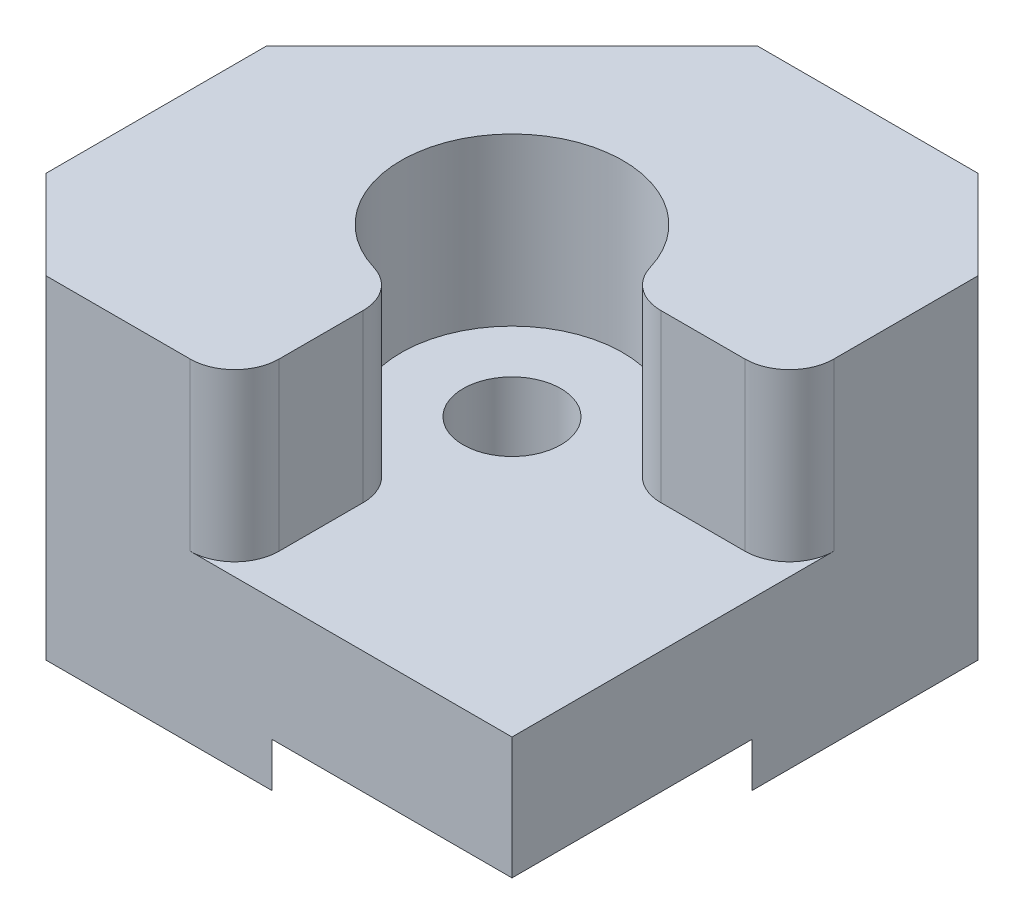
ISO-10303-21;
HEADER;
FILE_DESCRIPTION(('STEP AP214'),'2;1');
FILE_NAME('part.step','',(''),(''),'','','');
FILE_SCHEMA(('AUTOMOTIVE_DESIGN { 1 0 10303 214 1 1 1 1 }'));
ENDSEC;
DATA;
#1=APPLICATION_CONTEXT('core data for automotive mechanical design processes');
#2=APPLICATION_PROTOCOL_DEFINITION('international standard','automotive_design',2000,#1);
#3=PRODUCT_CONTEXT('',#1,'mechanical');
#4=PRODUCT('Part','Part','',(#3));
#5=PRODUCT_RELATED_PRODUCT_CATEGORY('part','',(#4));
#6=PRODUCT_DEFINITION_FORMATION('','',#4);
#7=PRODUCT_DEFINITION_CONTEXT('part definition',#1,'design');
#8=PRODUCT_DEFINITION('design','',#6,#7);
#9=PRODUCT_DEFINITION_SHAPE('','',#8);
#10=(LENGTH_UNIT() NAMED_UNIT(*) SI_UNIT(.MILLI.,.METRE.));
#11=(NAMED_UNIT(*) PLANE_ANGLE_UNIT() SI_UNIT($,.RADIAN.));
#12=(NAMED_UNIT(*) SI_UNIT($,.STERADIAN.) SOLID_ANGLE_UNIT());
#13=UNCERTAINTY_MEASURE_WITH_UNIT(LENGTH_MEASURE(1.E-05),#10,'distance_accuracy_value','');
#14=(GEOMETRIC_REPRESENTATION_CONTEXT(3) GLOBAL_UNCERTAINTY_ASSIGNED_CONTEXT((#13)) GLOBAL_UNIT_ASSIGNED_CONTEXT((#10,
#11,#12)) REPRESENTATION_CONTEXT('',''));
#15=CARTESIAN_POINT('',(0.,0.,0.));
#16=DIRECTION('',(0.,0.,1.));
#17=DIRECTION('',(1.,0.,0.));
#18=AXIS2_PLACEMENT_3D('',#15,#16,#17);
#19=CARTESIAN_POINT('',(0.,-7.5,0.));
#20=DIRECTION('',(0.,1.,0.));
#21=DIRECTION('',(0.,0.,1.));
#22=AXIS2_PLACEMENT_3D('',#19,#20,#21);
#23=PLANE('',#22);
#24=DIRECTION('',(1.,0.,0.));
#25=VECTOR('',#24,1.);
#26=CARTESIAN_POINT('',(-12.5,-7.5,12.5));
#27=LINE('',#26,#25);
#28=CARTESIAN_POINT('',(-8.49999999999999,-7.5,12.5));
#29=VERTEX_POINT('',#28);
#30=CARTESIAN_POINT('',(1.68126624784581,-7.5,12.5));
#31=VERTEX_POINT('',#30);
#32=EDGE_CURVE('E242',#29,#31,#27,.T.);
#33=ORIENTED_EDGE('',*,*,#32,.F.);
#34=DIRECTION('',(0.707106781186546,0.,0.707106781186549));
#35=VECTOR('',#34,1.);
#36=CARTESIAN_POINT('',(-8.49999999999999,-7.5,12.5));
#37=LINE('',#36,#35);
#38=CARTESIAN_POINT('',(-12.5,-7.5,8.49999999999997));
#39=VERTEX_POINT('',#38);
#40=EDGE_CURVE('E285',#29,#39,#37,.F.);
#41=ORIENTED_EDGE('',*,*,#40,.T.);
#42=DIRECTION('',(0.,0.,1.));
#43=VECTOR('',#42,1.);
#44=CARTESIAN_POINT('',(-12.5,-7.5,-12.5));
#45=LINE('',#44,#43);
#46=CARTESIAN_POINT('',(-12.5,-7.5,-1.68126624784581));
#47=VERTEX_POINT('',#46);
#48=EDGE_CURVE('E254',#47,#39,#45,.T.);
#49=ORIENTED_EDGE('',*,*,#48,.F.);
#50=DIRECTION('',(-0.707106781186548,0.,-0.707106781186547));
#51=VECTOR('',#50,1.);
#52=CARTESIAN_POINT('',(-12.5,-7.5,-1.68126624784581));
#53=LINE('',#52,#51);
#54=EDGE_CURVE('E397',#31,#47,#53,.T.);
#55=ORIENTED_EDGE('',*,*,#54,.F.);
#56=EDGE_LOOP('',(#33,#41,#49,#55));
#57=FACE_BOUND('',#56,.T.);
#58=ADVANCED_FACE('F39',(#57),#23,.F.);
#59=CARTESIAN_POINT('',(12.5,7.5,-12.5));
#60=DIRECTION('',(-1.,0.,0.));
#61=DIRECTION('',(0.,0.,1.));
#62=AXIS2_PLACEMENT_3D('',#59,#60,#61);
#63=PLANE('',#62);
#64=DIRECTION('',(0.,0.,-1.));
#65=VECTOR('',#64,1.);
#66=CARTESIAN_POINT('',(12.5,7.5,-12.5));
#67=LINE('',#66,#65);
#68=CARTESIAN_POINT('',(12.5,7.5,-2.));
#69=VERTEX_POINT('',#68);
#70=CARTESIAN_POINT('',(12.5,7.5,-8.50000000000001));
#71=VERTEX_POINT('',#70);
#72=EDGE_CURVE('E239',#69,#71,#67,.T.);
#73=ORIENTED_EDGE('',*,*,#72,.F.);
#74=DIRECTION('',(0.,1.,0.));
#75=VECTOR('',#74,1.);
#76=CARTESIAN_POINT('',(12.5,7.5,-2.));
#77=LINE('',#76,#75);
#78=CARTESIAN_POINT('',(12.5,0.,-2.));
#79=VERTEX_POINT('',#78);
#80=EDGE_CURVE('E309',#69,#79,#77,.F.);
#81=ORIENTED_EDGE('',*,*,#80,.T.);
#82=DIRECTION('',(0.,0.,1.));
#83=VECTOR('',#82,1.);
#84=CARTESIAN_POINT('',(12.5,0.,12.5));
#85=LINE('',#84,#83);
#86=CARTESIAN_POINT('',(12.5,0.,12.5));
#87=VERTEX_POINT('',#86);
#88=EDGE_CURVE('E226',#79,#87,#85,.T.);
#89=ORIENTED_EDGE('',*,*,#88,.T.);
#90=DIRECTION('',(0.,-1.,0.));
#91=VECTOR('',#90,1.);
#92=CARTESIAN_POINT('',(12.5,7.5,12.5));
#93=LINE('',#92,#91);
#94=CARTESIAN_POINT('',(12.5,-5.5,12.5));
#95=VERTEX_POINT('',#94);
#96=EDGE_CURVE('E250',#87,#95,#93,.T.);
#97=ORIENTED_EDGE('',*,*,#96,.T.);
#98=DIRECTION('',(0.,0.,1.));
#99=VECTOR('',#98,1.);
#100=CARTESIAN_POINT('',(12.5,-5.5,12.5));
#101=LINE('',#100,#99);
#102=CARTESIAN_POINT('',(12.5,-5.5,1.68126624784584));
#103=VERTEX_POINT('',#102);
#104=EDGE_CURVE('E198',#103,#95,#101,.T.);
#105=ORIENTED_EDGE('',*,*,#104,.F.);
#106=DIRECTION('',(0.,-1.,0.));
#107=VECTOR('',#106,1.);
#108=CARTESIAN_POINT('',(12.5,-5.5,1.68126624784584));
#109=LINE('',#108,#107);
#110=CARTESIAN_POINT('',(12.5,-7.5,1.68126624784584));
#111=VERTEX_POINT('',#110);
#112=EDGE_CURVE('E197',#103,#111,#109,.T.);
#113=ORIENTED_EDGE('',*,*,#112,.T.);
#114=DIRECTION('',(0.,0.,-1.));
#115=VECTOR('',#114,1.);
#116=CARTESIAN_POINT('',(12.5,-7.5,-12.5));
#117=LINE('',#116,#115);
#118=CARTESIAN_POINT('',(12.5,-7.5,-8.50000000000001));
#119=VERTEX_POINT('',#118);
#120=EDGE_CURVE('E238',#111,#119,#117,.T.);
#121=ORIENTED_EDGE('',*,*,#120,.T.);
#122=DIRECTION('',(0.,1.,0.));
#123=VECTOR('',#122,1.);
#124=CARTESIAN_POINT('',(12.5,7.5,-8.50000000000001));
#125=LINE('',#124,#123);
#126=EDGE_CURVE('E269',#119,#71,#125,.T.);
#127=ORIENTED_EDGE('',*,*,#126,.T.);
#128=EDGE_LOOP('',(#73,#81,#89,#97,#105,#113,#121,#127));
#129=FACE_BOUND('',#128,.T.);
#130=ADVANCED_FACE('F356',(#129),#63,.F.);
#131=CARTESIAN_POINT('',(-12.5,7.5,-12.5));
#132=DIRECTION('',(0.,0.,1.));
#133=DIRECTION('',(1.,0.,0.));
#134=AXIS2_PLACEMENT_3D('',#131,#132,#133);
#135=PLANE('',#134);
#136=DIRECTION('',(0.,1.,0.));
#137=VECTOR('',#136,1.);
#138=CARTESIAN_POINT('',(-8.49999999999999,7.5,-12.5));
#139=LINE('',#138,#137);
#140=CARTESIAN_POINT('',(-8.49999999999999,-5.5,-12.5));
#141=VERTEX_POINT('',#140);
#142=CARTESIAN_POINT('',(-8.49999999999999,2.49999999999998,-12.5));
#143=VERTEX_POINT('',#142);
#144=EDGE_CURVE('E260',#141,#143,#139,.T.);
#145=ORIENTED_EDGE('',*,*,#144,.T.);
#146=DIRECTION('',(0.816496580927726,0.577350269189627,0.));
#147=VECTOR('',#146,1.);
#148=CARTESIAN_POINT('',(-5.119288125423,4.89052429175126,-12.5));
#149=LINE('',#148,#147);
#150=CARTESIAN_POINT('',(-1.4289321881345,7.5,-12.5));
#151=VERTEX_POINT('',#150);
#152=EDGE_CURVE('E294',#143,#151,#149,.T.);
#153=ORIENTED_EDGE('',*,*,#152,.T.);
#154=DIRECTION('',(-1.,0.,0.));
#155=VECTOR('',#154,1.);
#156=CARTESIAN_POINT('',(-12.5,7.5,-12.5));
#157=LINE('',#156,#155);
#158=CARTESIAN_POINT('',(8.50000000000002,7.5,-12.5));
#159=VERTEX_POINT('',#158);
#160=EDGE_CURVE('E241',#159,#151,#157,.T.);
#161=ORIENTED_EDGE('',*,*,#160,.F.);
#162=DIRECTION('',(0.,-1.,0.));
#163=VECTOR('',#162,1.);
#164=CARTESIAN_POINT('',(8.50000000000002,7.5,-12.5));
#165=LINE('',#164,#163);
#166=CARTESIAN_POINT('',(8.50000000000002,-7.5,-12.5));
#167=VERTEX_POINT('',#166);
#168=EDGE_CURVE('E265',#159,#167,#165,.T.);
#169=ORIENTED_EDGE('',*,*,#168,.T.);
#170=DIRECTION('',(-1.,0.,0.));
#171=VECTOR('',#170,1.);
#172=CARTESIAN_POINT('',(-12.5,-7.5,-12.5));
#173=LINE('',#172,#171);
#174=CARTESIAN_POINT('',(-1.68126624784584,-7.5,-12.5));
#175=VERTEX_POINT('',#174);
#176=EDGE_CURVE('E203',#167,#175,#173,.T.);
#177=ORIENTED_EDGE('',*,*,#176,.T.);
#178=DIRECTION('',(0.,-1.,0.));
#179=VECTOR('',#178,1.);
#180=CARTESIAN_POINT('',(-1.68126624784584,-5.5,-12.5));
#181=LINE('',#180,#179);
#182=CARTESIAN_POINT('',(-1.68126624784584,-5.5,-12.5));
#183=VERTEX_POINT('',#182);
#184=EDGE_CURVE('E194',#183,#175,#181,.T.);
#185=ORIENTED_EDGE('',*,*,#184,.F.);
#186=DIRECTION('',(1.,0.,0.));
#187=VECTOR('',#186,1.);
#188=CARTESIAN_POINT('',(-1.68126624784584,-5.5,-12.5));
#189=LINE('',#188,#187);
#190=EDGE_CURVE('E176',#141,#183,#189,.T.);
#191=ORIENTED_EDGE('',*,*,#190,.F.);
#192=EDGE_LOOP('',(#145,#153,#161,#169,#177,#185,#191));
#193=FACE_BOUND('',#192,.T.);
#194=ADVANCED_FACE('F200',(#193),#135,.F.);
#195=CARTESIAN_POINT('',(-12.5,7.5,-12.5));
#196=DIRECTION('',(1.,0.,0.));
#197=DIRECTION('',(0.,0.,-1.));
#198=AXIS2_PLACEMENT_3D('',#195,#196,#197);
#199=PLANE('',#198);
#200=DIRECTION('',(0.,0.,1.));
#201=VECTOR('',#200,1.);
#202=CARTESIAN_POINT('',(-12.5,7.5,-12.5));
#203=LINE('',#202,#201);
#204=CARTESIAN_POINT('',(-12.5,7.5,-1.42893218813455));
#205=VERTEX_POINT('',#204);
#206=CARTESIAN_POINT('',(-12.5,7.5,8.49999999999997));
#207=VERTEX_POINT('',#206);
#208=EDGE_CURVE('E245',#205,#207,#203,.T.);
#209=ORIENTED_EDGE('',*,*,#208,.F.);
#210=DIRECTION('',(0.,-0.577350269189628,-0.816496580927725));
#211=VECTOR('',#210,1.);
#212=CARTESIAN_POINT('',(-12.5,4.89052429175127,-5.11928812542302));
#213=LINE('',#212,#211);
#214=CARTESIAN_POINT('',(-12.5,2.49999999999998,-8.50000000000002));
#215=VERTEX_POINT('',#214);
#216=EDGE_CURVE('E290',#205,#215,#213,.T.);
#217=ORIENTED_EDGE('',*,*,#216,.T.);
#218=DIRECTION('',(0.,-1.,0.));
#219=VECTOR('',#218,1.);
#220=CARTESIAN_POINT('',(-12.5,7.5,-8.50000000000002));
#221=LINE('',#220,#219);
#222=CARTESIAN_POINT('',(-12.5,-5.5,-8.50000000000002));
#223=VERTEX_POINT('',#222);
#224=EDGE_CURVE('E279',#215,#223,#221,.T.);
#225=ORIENTED_EDGE('',*,*,#224,.T.);
#226=DIRECTION('',(0.,0.,-1.));
#227=VECTOR('',#226,1.);
#228=CARTESIAN_POINT('',(-12.5,-5.5,-12.5));
#229=LINE('',#228,#227);
#230=CARTESIAN_POINT('',(-12.5,-5.5,-1.68126624784581));
#231=VERTEX_POINT('',#230);
#232=EDGE_CURVE('E189',#231,#223,#229,.T.);
#233=ORIENTED_EDGE('',*,*,#232,.F.);
#234=DIRECTION('',(0.,-1.,0.));
#235=VECTOR('',#234,1.);
#236=CARTESIAN_POINT('',(-12.5,-5.5,-1.68126624784581));
#237=LINE('',#236,#235);
#238=EDGE_CURVE('E263',#231,#47,#237,.T.);
#239=ORIENTED_EDGE('',*,*,#238,.T.);
#240=ORIENTED_EDGE('',*,*,#48,.T.);
#241=DIRECTION('',(0.,1.,0.));
#242=VECTOR('',#241,1.);
#243=CARTESIAN_POINT('',(-12.5,7.5,8.49999999999997));
#244=LINE('',#243,#242);
#245=EDGE_CURVE('E276',#39,#207,#244,.T.);
#246=ORIENTED_EDGE('',*,*,#245,.T.);
#247=EDGE_LOOP('',(#209,#217,#225,#233,#239,#240,#246));
#248=FACE_BOUND('',#247,.T.);
#249=ADVANCED_FACE('F371',(#248),#199,.F.);
#250=CARTESIAN_POINT('',(-12.5,7.5,12.5));
#251=DIRECTION('',(0.,0.,-1.));
#252=DIRECTION('',(-1.,0.,0.));
#253=AXIS2_PLACEMENT_3D('',#250,#251,#252);
#254=PLANE('',#253);
#255=DIRECTION('',(-1.,0.,0.));
#256=VECTOR('',#255,1.);
#257=CARTESIAN_POINT('',(0.,0.,12.5));
#258=LINE('',#257,#256);
#259=CARTESIAN_POINT('',(-2.,0.,12.5));
#260=VERTEX_POINT('',#259);
#261=EDGE_CURVE('E224',#87,#260,#258,.T.);
#262=ORIENTED_EDGE('',*,*,#261,.T.);
#263=DIRECTION('',(0.,1.,0.));
#264=VECTOR('',#263,1.);
#265=CARTESIAN_POINT('',(-2.,7.5,12.5));
#266=LINE('',#265,#264);
#267=CARTESIAN_POINT('',(-2.,7.5,12.5));
#268=VERTEX_POINT('',#267);
#269=EDGE_CURVE('E312',#260,#268,#266,.T.);
#270=ORIENTED_EDGE('',*,*,#269,.T.);
#271=DIRECTION('',(1.,0.,0.));
#272=VECTOR('',#271,1.);
#273=CARTESIAN_POINT('',(-12.5,7.5,12.5));
#274=LINE('',#273,#272);
#275=CARTESIAN_POINT('',(-8.49999999999999,7.5,12.5));
#276=VERTEX_POINT('',#275);
#277=EDGE_CURVE('E247',#276,#268,#274,.T.);
#278=ORIENTED_EDGE('',*,*,#277,.F.);
#279=DIRECTION('',(0.,-1.,0.));
#280=VECTOR('',#279,1.);
#281=CARTESIAN_POINT('',(-8.49999999999999,7.5,12.5));
#282=LINE('',#281,#280);
#283=EDGE_CURVE('E282',#276,#29,#282,.T.);
#284=ORIENTED_EDGE('',*,*,#283,.T.);
#285=ORIENTED_EDGE('',*,*,#32,.T.);
#286=DIRECTION('',(0.,-1.,0.));
#287=VECTOR('',#286,1.);
#288=CARTESIAN_POINT('',(1.68126624784581,-5.5,12.5));
#289=LINE('',#288,#287);
#290=CARTESIAN_POINT('',(1.68126624784581,-5.5,12.5));
#291=VERTEX_POINT('',#290);
#292=EDGE_CURVE('E206',#291,#31,#289,.T.);
#293=ORIENTED_EDGE('',*,*,#292,.F.);
#294=DIRECTION('',(-1.,0.,0.));
#295=VECTOR('',#294,1.);
#296=CARTESIAN_POINT('',(1.68126624784581,-5.5,12.5));
#297=LINE('',#296,#295);
#298=EDGE_CURVE('E209',#95,#291,#297,.T.);
#299=ORIENTED_EDGE('',*,*,#298,.F.);
#300=ORIENTED_EDGE('',*,*,#96,.F.);
#301=EDGE_LOOP('',(#262,#270,#278,#284,#285,#293,#299,#300));
#302=FACE_BOUND('',#301,.T.);
#303=ADVANCED_FACE('F382',(#302),#254,.F.);
#304=CARTESIAN_POINT('',(0.,7.5,0.));
#305=DIRECTION('',(0.,1.,0.));
#306=DIRECTION('',(0.,0.,1.));
#307=AXIS2_PLACEMENT_3D('',#304,#305,#306);
#308=PLANE('',#307);
#309=DIRECTION('',(-1.,0.,0.));
#310=VECTOR('',#309,1.);
#311=CARTESIAN_POINT('',(12.5,7.5,0.));
#312=LINE('',#311,#310);
#313=CARTESIAN_POINT('',(10.5,7.5,0.));
#314=VERTEX_POINT('',#313);
#315=CARTESIAN_POINT('',(6.70820393249937,7.5,0.));
#316=VERTEX_POINT('',#315);
#317=EDGE_CURVE('E216',#314,#316,#312,.T.);
#318=ORIENTED_EDGE('',*,*,#317,.F.);
#319=CARTESIAN_POINT('',(10.5,7.5,-2.));
#320=DIRECTION('',(0.,1.,0.));
#321=DIRECTION('',(0.,0.,1.));
#322=AXIS2_PLACEMENT_3D('',#319,#320,#321);
#323=CIRCLE('',#322,2.);
#324=EDGE_CURVE('E307',#314,#69,#323,.T.);
#325=ORIENTED_EDGE('',*,*,#324,.T.);
#326=ORIENTED_EDGE('',*,*,#72,.T.);
#327=DIRECTION('',(0.707106781186546,0.,0.707106781186549));
#328=VECTOR('',#327,1.);
#329=CARTESIAN_POINT('',(10.5,7.5,-10.5));
#330=LINE('',#329,#328);
#331=EDGE_CURVE('E274',#71,#159,#330,.F.);
#332=ORIENTED_EDGE('',*,*,#331,.T.);
#333=ORIENTED_EDGE('',*,*,#160,.T.);
#334=DIRECTION('',(-0.707106781186549,0.,0.707106781186546));
#335=VECTOR('',#334,1.);
#336=CARTESIAN_POINT('',(-6.96446609406726,7.5,-6.96446609406728));
#337=LINE('',#336,#335);
#338=EDGE_CURVE('E287',#151,#205,#337,.T.);
#339=ORIENTED_EDGE('',*,*,#338,.T.);
#340=ORIENTED_EDGE('',*,*,#208,.T.);
#341=DIRECTION('',(-0.707106781186546,0.,-0.707106781186549));
#342=VECTOR('',#341,1.);
#343=CARTESIAN_POINT('',(-10.5,7.5,10.5));
#344=LINE('',#343,#342);
#345=EDGE_CURVE('E272',#207,#276,#344,.F.);
#346=ORIENTED_EDGE('',*,*,#345,.T.);
#347=ORIENTED_EDGE('',*,*,#277,.T.);
#348=CARTESIAN_POINT('',(-2.,7.5,10.5));
#349=DIRECTION('',(0.,1.,0.));
#350=DIRECTION('',(0.,0.,1.));
#351=AXIS2_PLACEMENT_3D('',#348,#349,#350);
#352=CIRCLE('',#351,2.);
#353=CARTESIAN_POINT('',(0.,7.5,10.5));
#354=VERTEX_POINT('',#353);
#355=EDGE_CURVE('E305',#268,#354,#352,.T.);
#356=ORIENTED_EDGE('',*,*,#355,.T.);
#357=DIRECTION('',(0.,0.,1.));
#358=VECTOR('',#357,1.);
#359=CARTESIAN_POINT('',(0.,7.5,5.));
#360=LINE('',#359,#358);
#361=CARTESIAN_POINT('',(0.,7.5,6.70820393249937));
#362=VERTEX_POINT('',#361);
#363=EDGE_CURVE('E221',#362,#354,#360,.T.);
#364=ORIENTED_EDGE('',*,*,#363,.F.);
#365=CARTESIAN_POINT('',(-2.,7.5,6.70820393249937));
#366=DIRECTION('',(0.,1.,0.));
#367=DIRECTION('',(0.,0.,1.));
#368=AXIS2_PLACEMENT_3D('',#365,#366,#367);
#369=CIRCLE('',#368,2.);
#370=CARTESIAN_POINT('',(-1.42857142857143,7.5,4.79157423749955));
#371=VERTEX_POINT('',#370);
#372=EDGE_CURVE('E303',#362,#371,#369,.T.);
#373=ORIENTED_EDGE('',*,*,#372,.T.);
#374=CARTESIAN_POINT('',(0.,7.5,0.));
#375=DIRECTION('',(0.,1.,0.));
#376=DIRECTION('',(0.,0.,1.));
#377=AXIS2_PLACEMENT_3D('',#374,#375,#376);
#378=CIRCLE('',#377,5.);
#379=CARTESIAN_POINT('',(4.79157423749955,7.5,-1.42857142857143));
#380=VERTEX_POINT('',#379);
#381=EDGE_CURVE('E232',#380,#371,#378,.T.);
#382=ORIENTED_EDGE('',*,*,#381,.F.);
#383=CARTESIAN_POINT('',(6.70820393249937,7.5,-2.));
#384=DIRECTION('',(0.,1.,0.));
#385=DIRECTION('',(0.,0.,1.));
#386=AXIS2_PLACEMENT_3D('',#383,#384,#385);
#387=CIRCLE('',#386,2.);
#388=EDGE_CURVE('E301',#380,#316,#387,.T.);
#389=ORIENTED_EDGE('',*,*,#388,.T.);
#390=EDGE_LOOP('',(#318,#325,#326,#332,#333,#339,#340,#346,#347,#356,#364,#373,#382,#389));
#391=FACE_BOUND('',#390,.T.);
#392=ADVANCED_FACE('F342',(#391),#308,.T.);
#393=ORIENTED_EDGE('',*,*,#176,.F.);
#394=DIRECTION('',(-0.707106781186546,0.,-0.707106781186549));
#395=VECTOR('',#394,1.);
#396=CARTESIAN_POINT('',(8.50000000000002,-7.5,-12.5));
#397=LINE('',#396,#395);
#398=EDGE_CURVE('E267',#167,#119,#397,.F.);
#399=ORIENTED_EDGE('',*,*,#398,.T.);
#400=ORIENTED_EDGE('',*,*,#120,.F.);
#401=DIRECTION('',(0.707106781186548,0.,0.707106781186547));
#402=VECTOR('',#401,1.);
#403=CARTESIAN_POINT('',(12.5,-7.5,1.68126624784584));
#404=LINE('',#403,#402);
#405=EDGE_CURVE('E395',#175,#111,#404,.T.);
#406=ORIENTED_EDGE('',*,*,#405,.F.);
#407=EDGE_LOOP('',(#393,#399,#400,#406));
#408=FACE_BOUND('',#407,.T.);
#409=ADVANCED_FACE('F405',(#408),#23,.F.);
#410=CARTESIAN_POINT('',(0.,-24.7487373415292,5.));
#411=DIRECTION('',(-1.,0.,0.));
#412=DIRECTION('',(0.,0.,1.));
#413=AXIS2_PLACEMENT_3D('',#410,#411,#412);
#414=PLANE('',#413);
#415=ORIENTED_EDGE('',*,*,#363,.T.);
#416=DIRECTION('',(0.,1.,0.));
#417=VECTOR('',#416,1.);
#418=CARTESIAN_POINT('',(0.,-24.7487373415292,10.5));
#419=LINE('',#418,#417);
#420=CARTESIAN_POINT('',(0.,0.,10.5));
#421=VERTEX_POINT('',#420);
#422=EDGE_CURVE('E318',#354,#421,#419,.F.);
#423=ORIENTED_EDGE('',*,*,#422,.T.);
#424=DIRECTION('',(0.,0.,-1.));
#425=VECTOR('',#424,1.);
#426=CARTESIAN_POINT('',(0.,0.,5.));
#427=LINE('',#426,#425);
#428=CARTESIAN_POINT('',(0.,0.,6.70820393249937));
#429=VERTEX_POINT('',#428);
#430=EDGE_CURVE('E220',#421,#429,#427,.T.);
#431=ORIENTED_EDGE('',*,*,#430,.T.);
#432=DIRECTION('',(0.,1.,0.));
#433=VECTOR('',#432,1.);
#434=CARTESIAN_POINT('',(0.,-24.7487373415292,6.70820393249937));
#435=LINE('',#434,#433);
#436=EDGE_CURVE('E315',#429,#362,#435,.T.);
#437=ORIENTED_EDGE('',*,*,#436,.T.);
#438=EDGE_LOOP('',(#415,#423,#431,#437));
#439=FACE_BOUND('',#438,.T.);
#440=ADVANCED_FACE('F335',(#439),#414,.F.);
#441=CARTESIAN_POINT('',(0.,-24.7487373415292,0.));
#442=DIRECTION('',(0.,1.,0.));
#443=DIRECTION('',(0.,0.,1.));
#444=AXIS2_PLACEMENT_3D('',#441,#442,#443);
#445=CYLINDRICAL_SURFACE('',#444,5.);
#446=ORIENTED_EDGE('',*,*,#381,.T.);
#447=DIRECTION('',(0.,1.,0.));
#448=VECTOR('',#447,1.);
#449=CARTESIAN_POINT('',(-1.42857142857143,-24.7487373415292,4.79157423749955));
#450=LINE('',#449,#448);
#451=CARTESIAN_POINT('',(-1.42857142857143,0.,4.79157423749955));
#452=VERTEX_POINT('',#451);
#453=EDGE_CURVE('E59',#371,#452,#450,.F.);
#454=ORIENTED_EDGE('',*,*,#453,.T.);
#455=CARTESIAN_POINT('',(0.,0.,0.));
#456=DIRECTION('',(0.,1.,0.));
#457=DIRECTION('',(0.,0.,1.));
#458=AXIS2_PLACEMENT_3D('',#455,#456,#457);
#459=CIRCLE('',#458,5.);
#460=CARTESIAN_POINT('',(4.79157423749955,0.,-1.42857142857143));
#461=VERTEX_POINT('',#460);
#462=EDGE_CURVE('E218',#452,#461,#459,.F.);
#463=ORIENTED_EDGE('',*,*,#462,.T.);
#464=DIRECTION('',(0.,1.,0.));
#465=VECTOR('',#464,1.);
#466=CARTESIAN_POINT('',(4.79157423749955,-24.7487373415292,-1.42857142857143));
#467=LINE('',#466,#465);
#468=EDGE_CURVE('E320',#461,#380,#467,.T.);
#469=ORIENTED_EDGE('',*,*,#468,.T.);
#470=EDGE_LOOP('',(#446,#454,#463,#469));
#471=FACE_BOUND('',#470,.T.);
#472=ADVANCED_FACE('F343',(#471),#445,.F.);
#473=CARTESIAN_POINT('',(12.5,-24.7487373415292,0.));
#474=DIRECTION('',(0.,0.,-1.));
#475=DIRECTION('',(-1.,0.,0.));
#476=AXIS2_PLACEMENT_3D('',#473,#474,#475);
#477=PLANE('',#476);
#478=DIRECTION('',(1.,0.,0.));
#479=VECTOR('',#478,1.);
#480=CARTESIAN_POINT('',(12.5,0.,0.));
#481=LINE('',#480,#479);
#482=CARTESIAN_POINT('',(6.70820393249937,0.,0.));
#483=VERTEX_POINT('',#482);
#484=CARTESIAN_POINT('',(10.5,0.,0.));
#485=VERTEX_POINT('',#484);
#486=EDGE_CURVE('E229',#483,#485,#481,.T.);
#487=ORIENTED_EDGE('',*,*,#486,.T.);
#488=DIRECTION('',(0.,1.,0.));
#489=VECTOR('',#488,1.);
#490=CARTESIAN_POINT('',(10.5,-24.7487373415292,0.));
#491=LINE('',#490,#489);
#492=EDGE_CURVE('E298',#485,#314,#491,.T.);
#493=ORIENTED_EDGE('',*,*,#492,.T.);
#494=ORIENTED_EDGE('',*,*,#317,.T.);
#495=DIRECTION('',(0.,1.,0.));
#496=VECTOR('',#495,1.);
#497=CARTESIAN_POINT('',(6.70820393249937,-24.7487373415292,0.));
#498=LINE('',#497,#496);
#499=EDGE_CURVE('E296',#316,#483,#498,.F.);
#500=ORIENTED_EDGE('',*,*,#499,.T.);
#501=EDGE_LOOP('',(#487,#493,#494,#500));
#502=FACE_BOUND('',#501,.T.);
#503=ADVANCED_FACE('F348',(#502),#477,.F.);
#504=CARTESIAN_POINT('',(0.,0.,0.));
#505=DIRECTION('',(0.,1.,0.));
#506=DIRECTION('',(0.,0.,1.));
#507=AXIS2_PLACEMENT_3D('',#504,#505,#506);
#508=PLANE('',#507);
#509=CARTESIAN_POINT('',(0.,0.,0.));
#510=DIRECTION('',(0.,1.,0.));
#511=DIRECTION('',(0.,0.,1.));
#512=AXIS2_PLACEMENT_3D('',#509,#510,#511);
#513=CIRCLE('',#512,2.2);
#514=CARTESIAN_POINT('',(0.,0.,2.2));
#515=VERTEX_POINT('',#514);
#516=EDGE_CURVE('E213',#515,#515,#513,.T.);
#517=ORIENTED_EDGE('',*,*,#516,.F.);
#518=EDGE_LOOP('',(#517));
#519=FACE_BOUND('',#518,.T.);
#520=ORIENTED_EDGE('',*,*,#88,.F.);
#521=CARTESIAN_POINT('',(10.5,0.,-2.));
#522=DIRECTION('',(0.,1.,0.));
#523=DIRECTION('',(0.,0.,1.));
#524=AXIS2_PLACEMENT_3D('',#521,#522,#523);
#525=CIRCLE('',#524,2.);
#526=EDGE_CURVE('E324',#79,#485,#525,.F.);
#527=ORIENTED_EDGE('',*,*,#526,.T.);
#528=ORIENTED_EDGE('',*,*,#486,.F.);
#529=CARTESIAN_POINT('',(6.70820393249937,0.,-2.));
#530=DIRECTION('',(0.,1.,0.));
#531=DIRECTION('',(0.,0.,1.));
#532=AXIS2_PLACEMENT_3D('',#529,#530,#531);
#533=CIRCLE('',#532,2.);
#534=EDGE_CURVE('E11',#483,#461,#533,.F.);
#535=ORIENTED_EDGE('',*,*,#534,.T.);
#536=ORIENTED_EDGE('',*,*,#462,.F.);
#537=CARTESIAN_POINT('',(-2.,0.,6.70820393249937));
#538=DIRECTION('',(0.,1.,0.));
#539=DIRECTION('',(0.,0.,1.));
#540=AXIS2_PLACEMENT_3D('',#537,#538,#539);
#541=CIRCLE('',#540,2.);
#542=EDGE_CURVE('E47',#452,#429,#541,.F.);
#543=ORIENTED_EDGE('',*,*,#542,.T.);
#544=ORIENTED_EDGE('',*,*,#430,.F.);
#545=CARTESIAN_POINT('',(-2.,0.,10.5));
#546=DIRECTION('',(0.,1.,0.));
#547=DIRECTION('',(0.,0.,1.));
#548=AXIS2_PLACEMENT_3D('',#545,#546,#547);
#549=CIRCLE('',#548,2.);
#550=EDGE_CURVE('E326',#421,#260,#549,.F.);
#551=ORIENTED_EDGE('',*,*,#550,.T.);
#552=ORIENTED_EDGE('',*,*,#261,.F.);
#553=EDGE_LOOP('',(#520,#527,#528,#535,#536,#543,#544,#551,#552));
#554=FACE_BOUND('',#553,.T.);
#555=ADVANCED_FACE('F330',(#519,#554),#508,.T.);
#556=CARTESIAN_POINT('',(0.,-7.5,0.));
#557=DIRECTION('',(0.,1.,0.));
#558=DIRECTION('',(0.,0.,1.));
#559=AXIS2_PLACEMENT_3D('',#556,#557,#558);
#560=CYLINDRICAL_SURFACE('',#559,2.2);
#561=CARTESIAN_POINT('',(0.,-5.5,0.));
#562=DIRECTION('',(0.,1.,0.));
#563=DIRECTION('',(0.,0.,1.));
#564=AXIS2_PLACEMENT_3D('',#561,#562,#563);
#565=CIRCLE('',#564,2.2);
#566=CARTESIAN_POINT('',(0.,-5.5,2.2));
#567=VERTEX_POINT('',#566);
#568=EDGE_CURVE('E217',#567,#567,#565,.F.);
#569=ORIENTED_EDGE('',*,*,#568,.T.);
#570=EDGE_LOOP('',(#569));
#571=FACE_BOUND('',#570,.T.);
#572=ORIENTED_EDGE('',*,*,#516,.T.);
#573=EDGE_LOOP('',(#572));
#574=FACE_BOUND('',#573,.T.);
#575=ADVANCED_FACE('F429',(#571,#574),#560,.F.);
#576=CARTESIAN_POINT('',(0.,-5.5,0.));
#577=DIRECTION('',(0.,1.,0.));
#578=DIRECTION('',(0.,0.,1.));
#579=AXIS2_PLACEMENT_3D('',#576,#577,#578);
#580=PLANE('',#579);
#581=ORIENTED_EDGE('',*,*,#232,.T.);
#582=DIRECTION('',(-0.707106781186549,0.,0.707106781186546));
#583=VECTOR('',#582,1.);
#584=CARTESIAN_POINT('',(-12.5,-5.5,-8.50000000000002));
#585=LINE('',#584,#583);
#586=EDGE_CURVE('E184',#223,#141,#585,.F.);
#587=ORIENTED_EDGE('',*,*,#586,.T.);
#588=ORIENTED_EDGE('',*,*,#190,.T.);
#589=DIRECTION('',(0.707106781186548,0.,0.707106781186547));
#590=VECTOR('',#589,1.);
#591=CARTESIAN_POINT('',(12.5,-5.5,1.68126624784584));
#592=LINE('',#591,#590);
#593=EDGE_CURVE('E181',#183,#103,#592,.T.);
#594=ORIENTED_EDGE('',*,*,#593,.T.);
#595=ORIENTED_EDGE('',*,*,#104,.T.);
#596=ORIENTED_EDGE('',*,*,#298,.T.);
#597=DIRECTION('',(-0.707106781186548,0.,-0.707106781186547));
#598=VECTOR('',#597,1.);
#599=CARTESIAN_POINT('',(-12.5,-5.5,-1.68126624784581));
#600=LINE('',#599,#598);
#601=EDGE_CURVE('E204',#291,#231,#600,.T.);
#602=ORIENTED_EDGE('',*,*,#601,.T.);
#603=EDGE_LOOP('',(#581,#587,#588,#594,#595,#596,#602));
#604=FACE_BOUND('',#603,.T.);
#605=ORIENTED_EDGE('',*,*,#568,.F.);
#606=EDGE_LOOP('',(#605));
#607=FACE_BOUND('',#606,.T.);
#608=ADVANCED_FACE('F179',(#604,#607),#580,.F.);
#609=CARTESIAN_POINT('',(-12.5,-5.5,-1.68126624784581));
#610=DIRECTION('',(-0.707106781186547,0.,0.707106781186548));
#611=DIRECTION('',(0.707106781186548,0.,0.707106781186547));
#612=AXIS2_PLACEMENT_3D('',#609,#610,#611);
#613=PLANE('',#612);
#614=ORIENTED_EDGE('',*,*,#54,.T.);
#615=ORIENTED_EDGE('',*,*,#238,.F.);
#616=ORIENTED_EDGE('',*,*,#601,.F.);
#617=ORIENTED_EDGE('',*,*,#292,.T.);
#618=EDGE_LOOP('',(#614,#615,#616,#617));
#619=FACE_BOUND('',#618,.T.);
#620=ADVANCED_FACE('F401',(#619),#613,.F.);
#621=CARTESIAN_POINT('',(12.5,-5.5,1.68126624784584));
#622=DIRECTION('',(0.707106781186547,0.,-0.707106781186548));
#623=DIRECTION('',(-0.707106781186548,0.,-0.707106781186547));
#624=AXIS2_PLACEMENT_3D('',#621,#622,#623);
#625=PLANE('',#624);
#626=ORIENTED_EDGE('',*,*,#405,.T.);
#627=ORIENTED_EDGE('',*,*,#112,.F.);
#628=ORIENTED_EDGE('',*,*,#593,.F.);
#629=ORIENTED_EDGE('',*,*,#184,.T.);
#630=EDGE_LOOP('',(#626,#627,#628,#629));
#631=FACE_BOUND('',#630,.T.);
#632=ADVANCED_FACE('F193',(#631),#625,.F.);
#633=CARTESIAN_POINT('',(8.50000000000002,7.5,-12.5));
#634=DIRECTION('',(-0.707106781186549,0.,0.707106781186546));
#635=DIRECTION('',(0.,-1.,0.));
#636=AXIS2_PLACEMENT_3D('',#633,#634,#635);
#637=PLANE('',#636);
#638=ORIENTED_EDGE('',*,*,#331,.F.);
#639=ORIENTED_EDGE('',*,*,#126,.F.);
#640=ORIENTED_EDGE('',*,*,#398,.F.);
#641=ORIENTED_EDGE('',*,*,#168,.F.);
#642=EDGE_LOOP('',(#638,#639,#640,#641));
#643=FACE_BOUND('',#642,.T.);
#644=ADVANCED_FACE('F362',(#643),#637,.F.);
#645=CARTESIAN_POINT('',(-12.5,7.5,-8.50000000000002));
#646=DIRECTION('',(0.707106781186546,0.,0.707106781186549));
#647=DIRECTION('',(0.,-1.,0.));
#648=AXIS2_PLACEMENT_3D('',#645,#646,#647);
#649=PLANE('',#648);
#650=ORIENTED_EDGE('',*,*,#224,.F.);
#651=DIRECTION('',(-0.707106781186549,0.,0.707106781186546));
#652=VECTOR('',#651,1.);
#653=CARTESIAN_POINT('',(-12.5,2.49999999999998,-8.50000000000002));
#654=LINE('',#653,#652);
#655=EDGE_CURVE('E292',#215,#143,#654,.F.);
#656=ORIENTED_EDGE('',*,*,#655,.T.);
#657=ORIENTED_EDGE('',*,*,#144,.F.);
#658=ORIENTED_EDGE('',*,*,#586,.F.);
#659=EDGE_LOOP('',(#650,#656,#657,#658));
#660=FACE_BOUND('',#659,.T.);
#661=ADVANCED_FACE('F457',(#660),#649,.F.);
#662=CARTESIAN_POINT('',(-8.49999999999999,7.5,12.5));
#663=DIRECTION('',(0.707106781186549,0.,-0.707106781186546));
#664=DIRECTION('',(0.,-1.,0.));
#665=AXIS2_PLACEMENT_3D('',#662,#663,#664);
#666=PLANE('',#665);
#667=ORIENTED_EDGE('',*,*,#345,.F.);
#668=ORIENTED_EDGE('',*,*,#245,.F.);
#669=ORIENTED_EDGE('',*,*,#40,.F.);
#670=ORIENTED_EDGE('',*,*,#283,.F.);
#671=EDGE_LOOP('',(#667,#668,#669,#670));
#672=FACE_BOUND('',#671,.T.);
#673=ADVANCED_FACE('F379',(#672),#666,.F.);
#674=CARTESIAN_POINT('',(-6.96446609406726,7.5,-6.96446609406728));
#675=DIRECTION('',(-0.5,0.707106781186546,-0.500000000000002));
#676=DIRECTION('',(0.707106781186549,0.,-0.707106781186546));
#677=AXIS2_PLACEMENT_3D('',#674,#675,#676);
#678=PLANE('',#677);
#679=ORIENTED_EDGE('',*,*,#152,.F.);
#680=ORIENTED_EDGE('',*,*,#655,.F.);
#681=ORIENTED_EDGE('',*,*,#216,.F.);
#682=ORIENTED_EDGE('',*,*,#338,.F.);
#683=EDGE_LOOP('',(#679,#680,#681,#682));
#684=FACE_BOUND('',#683,.T.);
#685=ADVANCED_FACE('F368',(#684),#678,.T.);
#686=CARTESIAN_POINT('',(10.5,-24.7487373415292,-2.));
#687=DIRECTION('',(0.,1.,0.));
#688=DIRECTION('',(0.,0.,1.));
#689=AXIS2_PLACEMENT_3D('',#686,#687,#688);
#690=CYLINDRICAL_SURFACE('',#689,2.);
#691=ORIENTED_EDGE('',*,*,#526,.F.);
#692=ORIENTED_EDGE('',*,*,#80,.F.);
#693=ORIENTED_EDGE('',*,*,#324,.F.);
#694=ORIENTED_EDGE('',*,*,#492,.F.);
#695=EDGE_LOOP('',(#691,#692,#693,#694));
#696=FACE_BOUND('',#695,.T.);
#697=ADVANCED_FACE('F352',(#696),#690,.T.);
#698=CARTESIAN_POINT('',(-2.,7.5,10.5));
#699=DIRECTION('',(0.,1.,0.));
#700=DIRECTION('',(0.,0.,1.));
#701=AXIS2_PLACEMENT_3D('',#698,#699,#700);
#702=CYLINDRICAL_SURFACE('',#701,2.);
#703=ORIENTED_EDGE('',*,*,#550,.F.);
#704=ORIENTED_EDGE('',*,*,#422,.F.);
#705=ORIENTED_EDGE('',*,*,#355,.F.);
#706=ORIENTED_EDGE('',*,*,#269,.F.);
#707=EDGE_LOOP('',(#703,#704,#705,#706));
#708=FACE_BOUND('',#707,.T.);
#709=ADVANCED_FACE('F387',(#708),#702,.T.);
#710=CARTESIAN_POINT('',(-2.,-24.7487373415292,6.70820393249937));
#711=DIRECTION('',(0.,1.,0.));
#712=DIRECTION('',(0.,0.,1.));
#713=AXIS2_PLACEMENT_3D('',#710,#711,#712);
#714=CYLINDRICAL_SURFACE('',#713,2.);
#715=ORIENTED_EDGE('',*,*,#542,.F.);
#716=ORIENTED_EDGE('',*,*,#453,.F.);
#717=ORIENTED_EDGE('',*,*,#372,.F.);
#718=ORIENTED_EDGE('',*,*,#436,.F.);
#719=EDGE_LOOP('',(#715,#716,#717,#718));
#720=FACE_BOUND('',#719,.T.);
#721=ADVANCED_FACE('F338',(#720),#714,.T.);
#722=CARTESIAN_POINT('',(6.70820393249937,-24.7487373415292,-2.));
#723=DIRECTION('',(0.,1.,0.));
#724=DIRECTION('',(0.,0.,1.));
#725=AXIS2_PLACEMENT_3D('',#722,#723,#724);
#726=CYLINDRICAL_SURFACE('',#725,2.);
#727=ORIENTED_EDGE('',*,*,#534,.F.);
#728=ORIENTED_EDGE('',*,*,#499,.F.);
#729=ORIENTED_EDGE('',*,*,#388,.F.);
#730=ORIENTED_EDGE('',*,*,#468,.F.);
#731=EDGE_LOOP('',(#727,#728,#729,#730));
#732=FACE_BOUND('',#731,.T.);
#733=ADVANCED_FACE('F41',(#732),#726,.T.);
#734=CLOSED_SHELL('',(#58,#130,#194,#249,#303,#392,#409,#440,#472,#503,#555,#575,#608,#620,#632,
#644,#661,#673,#685,#697,#709,#721,#733));
#735=MANIFOLD_SOLID_BREP('B2',#734);
#736=ADVANCED_BREP_SHAPE_REPRESENTATION('',(#18,#735),#14);
#737=SHAPE_DEFINITION_REPRESENTATION(#9,#736);
ENDSEC;
END-ISO-10303-21;
